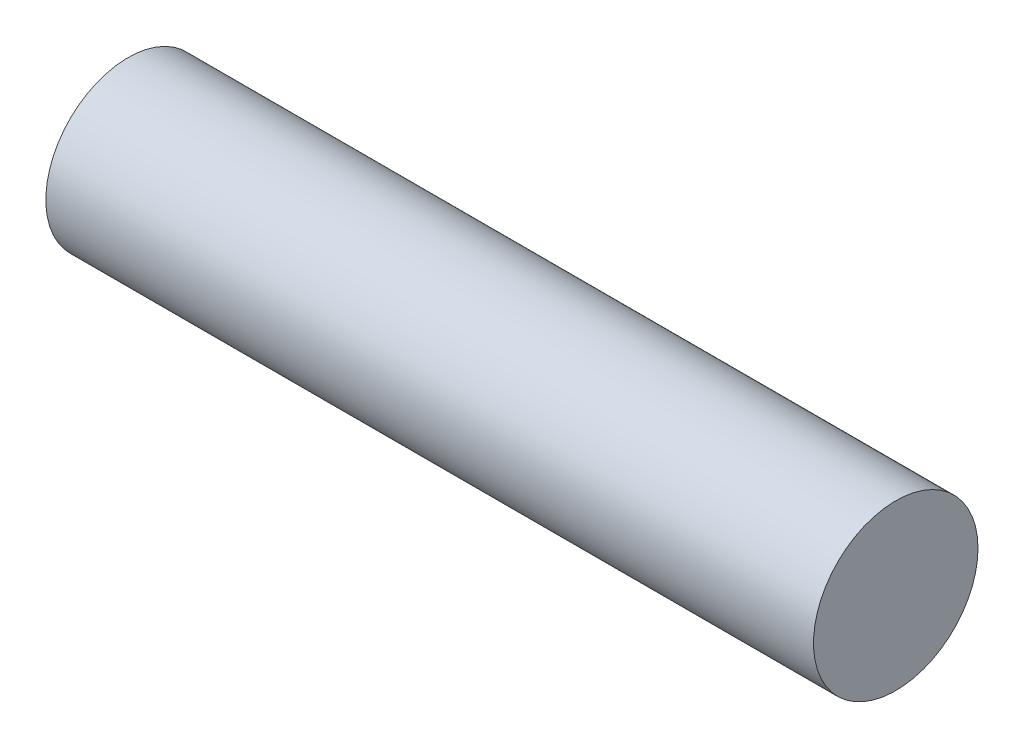
ISO-10303-21;
HEADER;
FILE_DESCRIPTION(('STEP AP214'),'2;1');
FILE_NAME('part.step','',(''),(''),'','','');
FILE_SCHEMA(('AUTOMOTIVE_DESIGN { 1 0 10303 214 1 1 1 1 }'));
ENDSEC;
DATA;
#1=APPLICATION_CONTEXT('core data for automotive mechanical design processes');
#2=APPLICATION_PROTOCOL_DEFINITION('international standard','automotive_design',2000,#1);
#3=PRODUCT_CONTEXT('',#1,'mechanical');
#4=PRODUCT('Part','Part','',(#3));
#5=PRODUCT_RELATED_PRODUCT_CATEGORY('part','',(#4));
#6=PRODUCT_DEFINITION_FORMATION('','',#4);
#7=PRODUCT_DEFINITION_CONTEXT('part definition',#1,'design');
#8=PRODUCT_DEFINITION('design','',#6,#7);
#9=PRODUCT_DEFINITION_SHAPE('','',#8);
#10=(LENGTH_UNIT() NAMED_UNIT(*) SI_UNIT(.MILLI.,.METRE.));
#11=(NAMED_UNIT(*) PLANE_ANGLE_UNIT() SI_UNIT($,.RADIAN.));
#12=(NAMED_UNIT(*) SI_UNIT($,.STERADIAN.) SOLID_ANGLE_UNIT());
#13=UNCERTAINTY_MEASURE_WITH_UNIT(LENGTH_MEASURE(1.E-05),#10,'distance_accuracy_value','');
#14=(GEOMETRIC_REPRESENTATION_CONTEXT(3) GLOBAL_UNCERTAINTY_ASSIGNED_CONTEXT((#13)) GLOBAL_UNIT_ASSIGNED_CONTEXT((#10,
#11,#12)) REPRESENTATION_CONTEXT('',''));
#15=CARTESIAN_POINT('',(0.,0.,0.));
#16=DIRECTION('',(0.,0.,1.));
#17=DIRECTION('',(1.,0.,0.));
#18=AXIS2_PLACEMENT_3D('',#15,#16,#17);
#19=CARTESIAN_POINT('',(14.,0.,0.));
#20=DIRECTION('',(-1.,0.,0.));
#21=DIRECTION('',(0.,0.,1.));
#22=AXIS2_PLACEMENT_3D('',#19,#20,#21);
#23=CYLINDRICAL_SURFACE('',#22,1.5);
#24=CARTESIAN_POINT('',(14.,0.,0.));
#25=DIRECTION('',(1.,0.,0.));
#26=DIRECTION('',(0.,0.,-1.));
#27=AXIS2_PLACEMENT_3D('',#24,#25,#26);
#28=CIRCLE('',#27,1.5);
#29=CARTESIAN_POINT('',(14.,0.,-1.5));
#30=VERTEX_POINT('',#29);
#31=EDGE_CURVE('E10',#30,#30,#28,.T.);
#32=ORIENTED_EDGE('',*,*,#31,.F.);
#33=EDGE_LOOP('',(#32));
#34=FACE_BOUND('',#33,.T.);
#35=CARTESIAN_POINT('',(0.,0.,0.));
#36=DIRECTION('',(1.,0.,0.));
#37=DIRECTION('',(0.,0.,-1.));
#38=AXIS2_PLACEMENT_3D('',#35,#36,#37);
#39=CIRCLE('',#38,1.5);
#40=CARTESIAN_POINT('',(0.,0.,-1.5));
#41=VERTEX_POINT('',#40);
#42=EDGE_CURVE('E40',#41,#41,#39,.T.);
#43=ORIENTED_EDGE('',*,*,#42,.T.);
#44=EDGE_LOOP('',(#43));
#45=FACE_BOUND('',#44,.T.);
#46=ADVANCED_FACE('F37',(#34,#45),#23,.T.);
#47=CARTESIAN_POINT('',(14.,0.,0.));
#48=DIRECTION('',(1.,0.,0.));
#49=DIRECTION('',(0.,0.,-1.));
#50=AXIS2_PLACEMENT_3D('',#47,#48,#49);
#51=PLANE('',#50);
#52=ORIENTED_EDGE('',*,*,#31,.T.);
#53=EDGE_LOOP('',(#52));
#54=FACE_BOUND('',#53,.T.);
#55=ADVANCED_FACE('F52',(#54),#51,.T.);
#56=CARTESIAN_POINT('',(0.,0.,0.));
#57=DIRECTION('',(1.,0.,0.));
#58=DIRECTION('',(0.,0.,-1.));
#59=AXIS2_PLACEMENT_3D('',#56,#57,#58);
#60=PLANE('',#59);
#61=ORIENTED_EDGE('',*,*,#42,.F.);
#62=EDGE_LOOP('',(#61));
#63=FACE_BOUND('',#62,.T.);
#64=ADVANCED_FACE('F50',(#63),#60,.F.);
#65=CLOSED_SHELL('',(#46,#55,#64));
#66=MANIFOLD_SOLID_BREP('B2',#65);
#67=ADVANCED_BREP_SHAPE_REPRESENTATION('',(#18,#66),#14);
#68=SHAPE_DEFINITION_REPRESENTATION(#9,#67);
ENDSEC;
END-ISO-10303-21;
